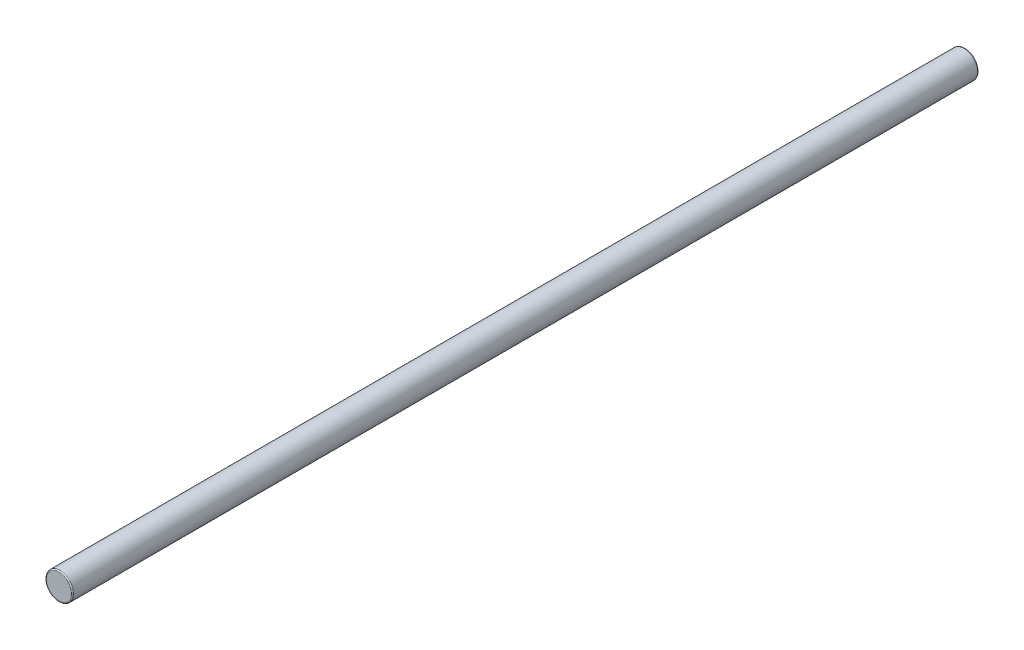
ISO-10303-21;
HEADER;
FILE_DESCRIPTION(('STEP AP214'),'2;1');
FILE_NAME('part.step','',(''),(''),'','','');
FILE_SCHEMA(('AUTOMOTIVE_DESIGN { 1 0 10303 214 1 1 1 1 }'));
ENDSEC;
DATA;
#1=APPLICATION_CONTEXT('core data for automotive mechanical design processes');
#2=APPLICATION_PROTOCOL_DEFINITION('international standard','automotive_design',2000,#1);
#3=PRODUCT_CONTEXT('',#1,'mechanical');
#4=PRODUCT('Part','Part','',(#3));
#5=PRODUCT_RELATED_PRODUCT_CATEGORY('part','',(#4));
#6=PRODUCT_DEFINITION_FORMATION('','',#4);
#7=PRODUCT_DEFINITION_CONTEXT('part definition',#1,'design');
#8=PRODUCT_DEFINITION('design','',#6,#7);
#9=PRODUCT_DEFINITION_SHAPE('','',#8);
#10=(LENGTH_UNIT() NAMED_UNIT(*) SI_UNIT(.MILLI.,.METRE.));
#11=(NAMED_UNIT(*) PLANE_ANGLE_UNIT() SI_UNIT($,.RADIAN.));
#12=(NAMED_UNIT(*) SI_UNIT($,.STERADIAN.) SOLID_ANGLE_UNIT());
#13=UNCERTAINTY_MEASURE_WITH_UNIT(LENGTH_MEASURE(1.E-05),#10,'distance_accuracy_value','');
#14=(GEOMETRIC_REPRESENTATION_CONTEXT(3) GLOBAL_UNCERTAINTY_ASSIGNED_CONTEXT((#13)) GLOBAL_UNIT_ASSIGNED_CONTEXT((#10,
#11,#12)) REPRESENTATION_CONTEXT('',''));
#15=CARTESIAN_POINT('',(0.,0.,0.));
#16=DIRECTION('',(0.,0.,1.));
#17=DIRECTION('',(1.,0.,0.));
#18=AXIS2_PLACEMENT_3D('',#15,#16,#17);
#19=CARTESIAN_POINT('',(0.,0.,400.));
#20=DIRECTION('',(0.,0.,-1.));
#21=DIRECTION('',(-1.,0.,0.));
#22=AXIS2_PLACEMENT_3D('',#19,#20,#21);
#23=CYLINDRICAL_SURFACE('',#22,6.);
#24=CARTESIAN_POINT('',(0.,0.,0.5));
#25=DIRECTION('',(0.,0.,1.));
#26=DIRECTION('',(1.,0.,0.));
#27=AXIS2_PLACEMENT_3D('',#24,#25,#26);
#28=CIRCLE('',#27,6.);
#29=CARTESIAN_POINT('',(6.,0.,0.5));
#30=VERTEX_POINT('',#29);
#31=EDGE_CURVE('E50',#30,#30,#28,.T.);
#32=ORIENTED_EDGE('',*,*,#31,.T.);
#33=EDGE_LOOP('',(#32));
#34=FACE_BOUND('',#33,.T.);
#35=CARTESIAN_POINT('',(0.,0.,399.5));
#36=DIRECTION('',(0.,0.,1.));
#37=DIRECTION('',(1.,0.,0.));
#38=AXIS2_PLACEMENT_3D('',#35,#36,#37);
#39=CIRCLE('',#38,6.);
#40=CARTESIAN_POINT('',(6.,0.,399.5));
#41=VERTEX_POINT('',#40);
#42=EDGE_CURVE('E55',#41,#41,#39,.F.);
#43=ORIENTED_EDGE('',*,*,#42,.T.);
#44=EDGE_LOOP('',(#43));
#45=FACE_BOUND('',#44,.T.);
#46=ADVANCED_FACE('F37',(#34,#45),#23,.T.);
#47=CARTESIAN_POINT('',(0.,0.,400.));
#48=DIRECTION('',(0.,0.,1.));
#49=DIRECTION('',(1.,0.,0.));
#50=AXIS2_PLACEMENT_3D('',#47,#48,#49);
#51=PLANE('',#50);
#52=CARTESIAN_POINT('',(0.,0.,400.));
#53=DIRECTION('',(0.,0.,1.));
#54=DIRECTION('',(1.,0.,0.));
#55=AXIS2_PLACEMENT_3D('',#52,#53,#54);
#56=CIRCLE('',#55,5.5);
#57=CARTESIAN_POINT('',(5.5,0.,400.));
#58=VERTEX_POINT('',#57);
#59=EDGE_CURVE('E10',#58,#58,#56,.T.);
#60=ORIENTED_EDGE('',*,*,#59,.T.);
#61=EDGE_LOOP('',(#60));
#62=FACE_BOUND('',#61,.T.);
#63=ADVANCED_FACE('F72',(#62),#51,.T.);
#64=CARTESIAN_POINT('',(0.,0.,0.));
#65=DIRECTION('',(0.,0.,1.));
#66=DIRECTION('',(1.,0.,0.));
#67=AXIS2_PLACEMENT_3D('',#64,#65,#66);
#68=PLANE('',#67);
#69=CARTESIAN_POINT('',(0.,0.,0.));
#70=DIRECTION('',(0.,0.,1.));
#71=DIRECTION('',(1.,0.,0.));
#72=AXIS2_PLACEMENT_3D('',#69,#70,#71);
#73=CIRCLE('',#72,5.5);
#74=CARTESIAN_POINT('',(5.5,0.,0.));
#75=VERTEX_POINT('',#74);
#76=EDGE_CURVE('E45',#75,#75,#73,.F.);
#77=ORIENTED_EDGE('',*,*,#76,.T.);
#78=EDGE_LOOP('',(#77));
#79=FACE_BOUND('',#78,.T.);
#80=ADVANCED_FACE('F69',(#79),#68,.F.);
#81=CARTESIAN_POINT('',(0.,0.,0.5));
#82=DIRECTION('',(0.,0.,1.));
#83=DIRECTION('',(1.,0.,0.));
#84=AXIS2_PLACEMENT_3D('',#81,#82,#83);
#85=TOROIDAL_SURFACE('',#84,5.5,0.5);
#86=ORIENTED_EDGE('',*,*,#76,.F.);
#87=EDGE_LOOP('',(#86));
#88=FACE_BOUND('',#87,.T.);
#89=ORIENTED_EDGE('',*,*,#31,.F.);
#90=EDGE_LOOP('',(#89));
#91=FACE_BOUND('',#90,.T.);
#92=ADVANCED_FACE('F65',(#88,#91),#85,.T.);
#93=CARTESIAN_POINT('',(0.,0.,399.5));
#94=DIRECTION('',(0.,0.,1.));
#95=DIRECTION('',(1.,0.,0.));
#96=AXIS2_PLACEMENT_3D('',#93,#94,#95);
#97=TOROIDAL_SURFACE('',#96,5.5,0.5);
#98=ORIENTED_EDGE('',*,*,#42,.F.);
#99=EDGE_LOOP('',(#98));
#100=FACE_BOUND('',#99,.T.);
#101=ORIENTED_EDGE('',*,*,#59,.F.);
#102=EDGE_LOOP('',(#101));
#103=FACE_BOUND('',#102,.T.);
#104=ADVANCED_FACE('F39',(#100,#103),#97,.T.);
#105=CLOSED_SHELL('',(#46,#63,#80,#92,#104));
#106=MANIFOLD_SOLID_BREP('B2',#105);
#107=ADVANCED_BREP_SHAPE_REPRESENTATION('',(#18,#106),#14);
#108=SHAPE_DEFINITION_REPRESENTATION(#9,#107);
ENDSEC;
END-ISO-10303-21;
